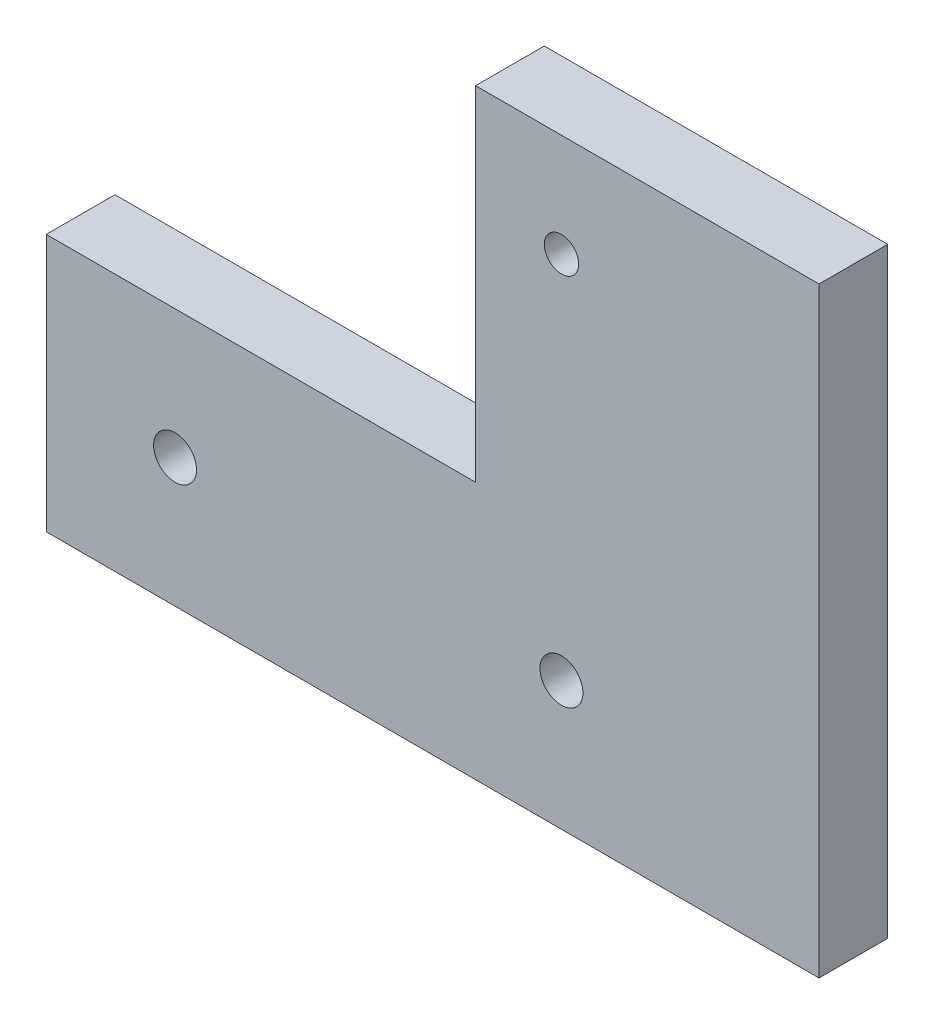
ISO-10303-21;
HEADER;
FILE_DESCRIPTION(('STEP AP214'),'2;1');
FILE_NAME('part.step','',(''),(''),'','','');
FILE_SCHEMA(('AUTOMOTIVE_DESIGN { 1 0 10303 214 1 1 1 1 }'));
ENDSEC;
DATA;
#1=APPLICATION_CONTEXT('core data for automotive mechanical design processes');
#2=APPLICATION_PROTOCOL_DEFINITION('international standard','automotive_design',2000,#1);
#3=PRODUCT_CONTEXT('',#1,'mechanical');
#4=PRODUCT('Part','Part','',(#3));
#5=PRODUCT_RELATED_PRODUCT_CATEGORY('part','',(#4));
#6=PRODUCT_DEFINITION_FORMATION('','',#4);
#7=PRODUCT_DEFINITION_CONTEXT('part definition',#1,'design');
#8=PRODUCT_DEFINITION('design','',#6,#7);
#9=PRODUCT_DEFINITION_SHAPE('','',#8);
#10=(LENGTH_UNIT() NAMED_UNIT(*) SI_UNIT(.MILLI.,.METRE.));
#11=(NAMED_UNIT(*) PLANE_ANGLE_UNIT() SI_UNIT($,.RADIAN.));
#12=(NAMED_UNIT(*) SI_UNIT($,.STERADIAN.) SOLID_ANGLE_UNIT());
#13=UNCERTAINTY_MEASURE_WITH_UNIT(LENGTH_MEASURE(1.E-05),#10,'distance_accuracy_value','');
#14=(GEOMETRIC_REPRESENTATION_CONTEXT(3) GLOBAL_UNCERTAINTY_ASSIGNED_CONTEXT((#13)) GLOBAL_UNIT_ASSIGNED_CONTEXT((#10,
#11,#12)) REPRESENTATION_CONTEXT('',''));
#15=CARTESIAN_POINT('',(0.,0.,0.));
#16=DIRECTION('',(0.,0.,1.));
#17=DIRECTION('',(1.,0.,0.));
#18=AXIS2_PLACEMENT_3D('',#15,#16,#17);
#19=CARTESIAN_POINT('',(0.,0.,8.));
#20=DIRECTION('',(0.,0.,-1.));
#21=DIRECTION('',(-1.,0.,0.));
#22=AXIS2_PLACEMENT_3D('',#19,#20,#21);
#23=PLANE('',#22);
#24=CARTESIAN_POINT('',(-40.7249394487575,5.2940615351541,8.));
#25=DIRECTION('',(0.,0.,-1.));
#26=DIRECTION('',(-1.,0.,0.));
#27=AXIS2_PLACEMENT_3D('',#24,#25,#26);
#28=CIRCLE('',#27,2.);
#29=CARTESIAN_POINT('',(-42.7249394487575,5.2940615351541,8.));
#30=VERTEX_POINT('',#29);
#31=EDGE_CURVE('E186',#30,#30,#28,.T.);
#32=ORIENTED_EDGE('',*,*,#31,.T.);
#33=EDGE_LOOP('',(#32));
#34=FACE_BOUND('',#33,.T.);
#35=CARTESIAN_POINT('',(-85.7249394487575,-37.7059384648459,8.));
#36=DIRECTION('',(0.,0.,1.));
#37=DIRECTION('',(1.,0.,0.));
#38=AXIS2_PLACEMENT_3D('',#35,#36,#37);
#39=CIRCLE('',#38,2.5);
#40=CARTESIAN_POINT('',(-83.2249394487575,-37.7059384648459,8.));
#41=VERTEX_POINT('',#40);
#42=EDGE_CURVE('E124',#41,#41,#39,.T.);
#43=ORIENTED_EDGE('',*,*,#42,.F.);
#44=EDGE_LOOP('',(#43));
#45=FACE_BOUND('',#44,.T.);
#46=DIRECTION('',(0.,-1.,0.));
#47=VECTOR('',#46,1.);
#48=CARTESIAN_POINT('',(-50.7249394487575,-22.7059384648459,8.));
#49=LINE('',#48,#47);
#50=CARTESIAN_POINT('',(-50.7249394487575,17.2940615351541,8.));
#51=VERTEX_POINT('',#50);
#52=CARTESIAN_POINT('',(-50.7249394487575,-22.7059384648459,8.));
#53=VERTEX_POINT('',#52);
#54=EDGE_CURVE('E131',#51,#53,#49,.T.);
#55=ORIENTED_EDGE('',*,*,#54,.T.);
#56=DIRECTION('',(-1.,0.,0.));
#57=VECTOR('',#56,1.);
#58=CARTESIAN_POINT('',(-100.724939448757,-22.7059384648459,8.));
#59=LINE('',#58,#57);
#60=CARTESIAN_POINT('',(-100.724939448757,-22.7059384648459,8.));
#61=VERTEX_POINT('',#60);
#62=EDGE_CURVE('E89',#53,#61,#59,.T.);
#63=ORIENTED_EDGE('',*,*,#62,.T.);
#64=DIRECTION('',(0.,-1.,0.));
#65=VECTOR('',#64,1.);
#66=CARTESIAN_POINT('',(-100.724939448757,-52.7059384648459,8.));
#67=LINE('',#66,#65);
#68=CARTESIAN_POINT('',(-100.724939448757,-52.7059384648459,8.));
#69=VERTEX_POINT('',#68);
#70=EDGE_CURVE('E102',#61,#69,#67,.T.);
#71=ORIENTED_EDGE('',*,*,#70,.T.);
#72=DIRECTION('',(1.,0.,0.));
#73=VECTOR('',#72,1.);
#74=CARTESIAN_POINT('',(-10.7249394487575,-52.7059384648459,8.));
#75=LINE('',#74,#73);
#76=CARTESIAN_POINT('',(-10.7249394487575,-52.7059384648459,8.));
#77=VERTEX_POINT('',#76);
#78=EDGE_CURVE('E96',#69,#77,#75,.T.);
#79=ORIENTED_EDGE('',*,*,#78,.T.);
#80=DIRECTION('',(0.,1.,0.));
#81=VECTOR('',#80,1.);
#82=CARTESIAN_POINT('',(-10.7249394487575,17.2940615351541,8.));
#83=LINE('',#82,#81);
#84=CARTESIAN_POINT('',(-10.7249394487575,17.2940615351541,8.));
#85=VERTEX_POINT('',#84);
#86=EDGE_CURVE('E100',#77,#85,#83,.T.);
#87=ORIENTED_EDGE('',*,*,#86,.T.);
#88=DIRECTION('',(-1.,0.,0.));
#89=VECTOR('',#88,1.);
#90=CARTESIAN_POINT('',(-50.7249394487575,17.2940615351541,8.));
#91=LINE('',#90,#89);
#92=EDGE_CURVE('E52',#85,#51,#91,.T.);
#93=ORIENTED_EDGE('',*,*,#92,.T.);
#94=EDGE_LOOP('',(#55,#63,#71,#79,#87,#93));
#95=FACE_BOUND('',#94,.T.);
#96=CARTESIAN_POINT('',(-40.7249394487575,-37.7059384648459,8.));
#97=DIRECTION('',(0.,0.,1.));
#98=DIRECTION('',(1.,0.,0.));
#99=AXIS2_PLACEMENT_3D('',#96,#97,#98);
#100=CIRCLE('',#99,2.5);
#101=CARTESIAN_POINT('',(-38.2249394487575,-37.7059384648459,8.));
#102=VERTEX_POINT('',#101);
#103=EDGE_CURVE('E200',#102,#102,#100,.T.);
#104=ORIENTED_EDGE('',*,*,#103,.F.);
#105=EDGE_LOOP('',(#104));
#106=FACE_BOUND('',#105,.T.);
#107=ADVANCED_FACE('F35',(#34,#45,#95,#106),#23,.F.);
#108=CARTESIAN_POINT('',(0.,0.,0.));
#109=DIRECTION('',(0.,0.,-1.));
#110=DIRECTION('',(-1.,0.,0.));
#111=AXIS2_PLACEMENT_3D('',#108,#109,#110);
#112=PLANE('',#111);
#113=CARTESIAN_POINT('',(-40.7249394487575,5.2940615351541,0.));
#114=DIRECTION('',(0.,0.,-1.));
#115=DIRECTION('',(-1.,0.,0.));
#116=AXIS2_PLACEMENT_3D('',#113,#114,#115);
#117=CIRCLE('',#116,7.5);
#118=CARTESIAN_POINT('',(-48.2249394487575,5.2940615351541,0.));
#119=VERTEX_POINT('',#118);
#120=EDGE_CURVE('E191',#119,#119,#117,.T.);
#121=ORIENTED_EDGE('',*,*,#120,.F.);
#122=EDGE_LOOP('',(#121));
#123=FACE_BOUND('',#122,.T.);
#124=CARTESIAN_POINT('',(-85.7249394487575,-37.7059384648459,0.));
#125=DIRECTION('',(0.,0.,1.));
#126=DIRECTION('',(1.,0.,0.));
#127=AXIS2_PLACEMENT_3D('',#124,#125,#126);
#128=CIRCLE('',#127,2.5);
#129=CARTESIAN_POINT('',(-83.2249394487575,-37.7059384648459,0.));
#130=VERTEX_POINT('',#129);
#131=EDGE_CURVE('E203',#130,#130,#128,.T.);
#132=ORIENTED_EDGE('',*,*,#131,.T.);
#133=EDGE_LOOP('',(#132));
#134=FACE_BOUND('',#133,.T.);
#135=DIRECTION('',(0.,-1.,0.));
#136=VECTOR('',#135,1.);
#137=CARTESIAN_POINT('',(-50.7249394487575,-22.7059384648459,0.));
#138=LINE('',#137,#136);
#139=CARTESIAN_POINT('',(-50.7249394487575,17.2940615351541,0.));
#140=VERTEX_POINT('',#139);
#141=CARTESIAN_POINT('',(-50.7249394487575,-22.7059384648459,0.));
#142=VERTEX_POINT('',#141);
#143=EDGE_CURVE('E120',#140,#142,#138,.T.);
#144=ORIENTED_EDGE('',*,*,#143,.F.);
#145=DIRECTION('',(-1.,0.,0.));
#146=VECTOR('',#145,1.);
#147=CARTESIAN_POINT('',(-50.7249394487575,17.2940615351541,0.));
#148=LINE('',#147,#146);
#149=CARTESIAN_POINT('',(-10.7249394487575,17.2940615351541,0.));
#150=VERTEX_POINT('',#149);
#151=EDGE_CURVE('E81',#150,#140,#148,.T.);
#152=ORIENTED_EDGE('',*,*,#151,.F.);
#153=DIRECTION('',(0.,1.,0.));
#154=VECTOR('',#153,1.);
#155=CARTESIAN_POINT('',(-10.7249394487575,17.2940615351541,0.));
#156=LINE('',#155,#154);
#157=CARTESIAN_POINT('',(-10.7249394487575,-52.7059384648459,0.));
#158=VERTEX_POINT('',#157);
#159=EDGE_CURVE('E75',#158,#150,#156,.T.);
#160=ORIENTED_EDGE('',*,*,#159,.F.);
#161=DIRECTION('',(1.,0.,0.));
#162=VECTOR('',#161,1.);
#163=CARTESIAN_POINT('',(-10.7249394487575,-52.7059384648459,0.));
#164=LINE('',#163,#162);
#165=CARTESIAN_POINT('',(-100.724939448757,-52.7059384648459,0.));
#166=VERTEX_POINT('',#165);
#167=EDGE_CURVE('E110',#166,#158,#164,.T.);
#168=ORIENTED_EDGE('',*,*,#167,.F.);
#169=DIRECTION('',(0.,-1.,0.));
#170=VECTOR('',#169,1.);
#171=CARTESIAN_POINT('',(-100.724939448757,-52.7059384648459,0.));
#172=LINE('',#171,#170);
#173=CARTESIAN_POINT('',(-100.724939448757,-22.7059384648459,0.));
#174=VERTEX_POINT('',#173);
#175=EDGE_CURVE('E126',#174,#166,#172,.T.);
#176=ORIENTED_EDGE('',*,*,#175,.F.);
#177=DIRECTION('',(-1.,0.,0.));
#178=VECTOR('',#177,1.);
#179=CARTESIAN_POINT('',(-100.724939448757,-22.7059384648459,0.));
#180=LINE('',#179,#178);
#181=EDGE_CURVE('E123',#142,#174,#180,.T.);
#182=ORIENTED_EDGE('',*,*,#181,.F.);
#183=EDGE_LOOP('',(#144,#152,#160,#168,#176,#182));
#184=FACE_BOUND('',#183,.T.);
#185=CARTESIAN_POINT('',(-40.7249394487575,-37.7059384648459,0.));
#186=DIRECTION('',(0.,0.,1.));
#187=DIRECTION('',(1.,0.,0.));
#188=AXIS2_PLACEMENT_3D('',#185,#186,#187);
#189=CIRCLE('',#188,2.5);
#190=CARTESIAN_POINT('',(-38.2249394487575,-37.7059384648459,0.));
#191=VERTEX_POINT('',#190);
#192=EDGE_CURVE('E197',#191,#191,#189,.T.);
#193=ORIENTED_EDGE('',*,*,#192,.T.);
#194=EDGE_LOOP('',(#193));
#195=FACE_BOUND('',#194,.T.);
#196=ADVANCED_FACE('F140',(#123,#134,#184,#195),#112,.T.);
#197=CARTESIAN_POINT('',(-50.7249394487575,-22.7059384648459,8.));
#198=DIRECTION('',(1.,0.,0.));
#199=DIRECTION('',(0.,0.,-1.));
#200=AXIS2_PLACEMENT_3D('',#197,#198,#199);
#201=PLANE('',#200);
#202=ORIENTED_EDGE('',*,*,#143,.T.);
#203=DIRECTION('',(0.,0.,-1.));
#204=VECTOR('',#203,1.);
#205=CARTESIAN_POINT('',(-50.7249394487575,-22.7059384648459,8.));
#206=LINE('',#205,#204);
#207=EDGE_CURVE('E11',#53,#142,#206,.T.);
#208=ORIENTED_EDGE('',*,*,#207,.F.);
#209=ORIENTED_EDGE('',*,*,#54,.F.);
#210=DIRECTION('',(0.,0.,-1.));
#211=VECTOR('',#210,1.);
#212=CARTESIAN_POINT('',(-50.7249394487575,17.2940615351541,8.));
#213=LINE('',#212,#211);
#214=EDGE_CURVE('E116',#51,#140,#213,.T.);
#215=ORIENTED_EDGE('',*,*,#214,.T.);
#216=EDGE_LOOP('',(#202,#208,#209,#215));
#217=FACE_BOUND('',#216,.T.);
#218=ADVANCED_FACE('F37',(#217),#201,.F.);
#219=CARTESIAN_POINT('',(-100.724939448757,-22.7059384648459,8.));
#220=DIRECTION('',(0.,-1.,0.));
#221=DIRECTION('',(0.,0.,-1.));
#222=AXIS2_PLACEMENT_3D('',#219,#220,#221);
#223=PLANE('',#222);
#224=ORIENTED_EDGE('',*,*,#181,.T.);
#225=DIRECTION('',(0.,0.,-1.));
#226=VECTOR('',#225,1.);
#227=CARTESIAN_POINT('',(-100.724939448757,-22.7059384648459,8.));
#228=LINE('',#227,#226);
#229=EDGE_CURVE('E44',#61,#174,#228,.T.);
#230=ORIENTED_EDGE('',*,*,#229,.F.);
#231=ORIENTED_EDGE('',*,*,#62,.F.);
#232=ORIENTED_EDGE('',*,*,#207,.T.);
#233=EDGE_LOOP('',(#224,#230,#231,#232));
#234=FACE_BOUND('',#233,.T.);
#235=ADVANCED_FACE('F266',(#234),#223,.F.);
#236=CARTESIAN_POINT('',(-100.724939448757,-52.7059384648459,8.));
#237=DIRECTION('',(1.,0.,0.));
#238=DIRECTION('',(0.,0.,-1.));
#239=AXIS2_PLACEMENT_3D('',#236,#237,#238);
#240=PLANE('',#239);
#241=ORIENTED_EDGE('',*,*,#175,.T.);
#242=DIRECTION('',(0.,0.,-1.));
#243=VECTOR('',#242,1.);
#244=CARTESIAN_POINT('',(-100.724939448757,-52.7059384648459,8.));
#245=LINE('',#244,#243);
#246=EDGE_CURVE('E111',#69,#166,#245,.T.);
#247=ORIENTED_EDGE('',*,*,#246,.F.);
#248=ORIENTED_EDGE('',*,*,#70,.F.);
#249=ORIENTED_EDGE('',*,*,#229,.T.);
#250=EDGE_LOOP('',(#241,#247,#248,#249));
#251=FACE_BOUND('',#250,.T.);
#252=ADVANCED_FACE('F137',(#251),#240,.F.);
#253=CARTESIAN_POINT('',(-10.7249394487575,-52.7059384648459,8.));
#254=DIRECTION('',(0.,1.,0.));
#255=DIRECTION('',(-1.,0.,0.));
#256=AXIS2_PLACEMENT_3D('',#253,#254,#255);
#257=PLANE('',#256);
#258=ORIENTED_EDGE('',*,*,#167,.T.);
#259=DIRECTION('',(0.,0.,-1.));
#260=VECTOR('',#259,1.);
#261=CARTESIAN_POINT('',(-10.7249394487575,-52.7059384648459,8.));
#262=LINE('',#261,#260);
#263=EDGE_CURVE('E107',#77,#158,#262,.T.);
#264=ORIENTED_EDGE('',*,*,#263,.F.);
#265=ORIENTED_EDGE('',*,*,#78,.F.);
#266=ORIENTED_EDGE('',*,*,#246,.T.);
#267=EDGE_LOOP('',(#258,#264,#265,#266));
#268=FACE_BOUND('',#267,.T.);
#269=ADVANCED_FACE('F108',(#268),#257,.F.);
#270=CARTESIAN_POINT('',(-10.7249394487575,17.2940615351541,8.));
#271=DIRECTION('',(-1.,0.,0.));
#272=DIRECTION('',(0.,-1.,0.));
#273=AXIS2_PLACEMENT_3D('',#270,#271,#272);
#274=PLANE('',#273);
#275=ORIENTED_EDGE('',*,*,#159,.T.);
#276=DIRECTION('',(0.,0.,-1.));
#277=VECTOR('',#276,1.);
#278=CARTESIAN_POINT('',(-10.7249394487575,17.2940615351541,8.));
#279=LINE('',#278,#277);
#280=EDGE_CURVE('E112',#85,#150,#279,.T.);
#281=ORIENTED_EDGE('',*,*,#280,.F.);
#282=ORIENTED_EDGE('',*,*,#86,.F.);
#283=ORIENTED_EDGE('',*,*,#263,.T.);
#284=EDGE_LOOP('',(#275,#281,#282,#283));
#285=FACE_BOUND('',#284,.T.);
#286=ADVANCED_FACE('F114',(#285),#274,.F.);
#287=CARTESIAN_POINT('',(-50.7249394487575,17.2940615351541,8.));
#288=DIRECTION('',(0.,-1.,0.));
#289=DIRECTION('',(1.,0.,0.));
#290=AXIS2_PLACEMENT_3D('',#287,#288,#289);
#291=PLANE('',#290);
#292=ORIENTED_EDGE('',*,*,#151,.T.);
#293=ORIENTED_EDGE('',*,*,#214,.F.);
#294=ORIENTED_EDGE('',*,*,#92,.F.);
#295=ORIENTED_EDGE('',*,*,#280,.T.);
#296=EDGE_LOOP('',(#292,#293,#294,#295));
#297=FACE_BOUND('',#296,.T.);
#298=ADVANCED_FACE('F145',(#297),#291,.F.);
#299=CARTESIAN_POINT('',(-85.7249394487575,-37.7059384648459,8.));
#300=DIRECTION('',(0.,0.,-1.));
#301=DIRECTION('',(-1.,0.,0.));
#302=AXIS2_PLACEMENT_3D('',#299,#300,#301);
#303=CYLINDRICAL_SURFACE('',#302,2.5);
#304=ORIENTED_EDGE('',*,*,#42,.T.);
#305=EDGE_LOOP('',(#304));
#306=FACE_BOUND('',#305,.T.);
#307=ORIENTED_EDGE('',*,*,#131,.F.);
#308=EDGE_LOOP('',(#307));
#309=FACE_BOUND('',#308,.T.);
#310=ADVANCED_FACE('F147',(#306,#309),#303,.F.);
#311=CARTESIAN_POINT('',(-40.7249394487575,-37.7059384648459,8.));
#312=DIRECTION('',(0.,0.,-1.));
#313=DIRECTION('',(-1.,0.,0.));
#314=AXIS2_PLACEMENT_3D('',#311,#312,#313);
#315=CYLINDRICAL_SURFACE('',#314,2.5);
#316=ORIENTED_EDGE('',*,*,#103,.T.);
#317=EDGE_LOOP('',(#316));
#318=FACE_BOUND('',#317,.T.);
#319=ORIENTED_EDGE('',*,*,#192,.F.);
#320=EDGE_LOOP('',(#319));
#321=FACE_BOUND('',#320,.T.);
#322=ADVANCED_FACE('F153',(#318,#321),#315,.F.);
#323=CARTESIAN_POINT('',(-40.7249394487575,5.2940615351541,5.));
#324=DIRECTION('',(0.,0.,-1.));
#325=DIRECTION('',(-1.,0.,0.));
#326=AXIS2_PLACEMENT_3D('',#323,#324,#325);
#327=CYLINDRICAL_SURFACE('',#326,7.5);
#328=CARTESIAN_POINT('',(-40.7249394487575,5.2940615351541,5.));
#329=DIRECTION('',(0.,0.,-1.));
#330=DIRECTION('',(-1.,0.,0.));
#331=AXIS2_PLACEMENT_3D('',#328,#329,#330);
#332=CIRCLE('',#331,7.5);
#333=CARTESIAN_POINT('',(-48.2249394487575,5.2940615351541,5.));
#334=VERTEX_POINT('',#333);
#335=EDGE_CURVE('E194',#334,#334,#332,.T.);
#336=ORIENTED_EDGE('',*,*,#335,.F.);
#337=EDGE_LOOP('',(#336));
#338=FACE_BOUND('',#337,.T.);
#339=ORIENTED_EDGE('',*,*,#120,.T.);
#340=EDGE_LOOP('',(#339));
#341=FACE_BOUND('',#340,.T.);
#342=ADVANCED_FACE('F170',(#338,#341),#327,.F.);
#343=CARTESIAN_POINT('',(-40.7249394487575,5.2940615351541,5.));
#344=DIRECTION('',(0.,0.,-1.));
#345=DIRECTION('',(-1.,0.,0.));
#346=AXIS2_PLACEMENT_3D('',#343,#344,#345);
#347=PLANE('',#346);
#348=CARTESIAN_POINT('',(-40.7249394487575,5.2940615351541,5.));
#349=DIRECTION('',(0.,0.,-1.));
#350=DIRECTION('',(-1.,0.,0.));
#351=AXIS2_PLACEMENT_3D('',#348,#349,#350);
#352=CIRCLE('',#351,2.);
#353=CARTESIAN_POINT('',(-42.7249394487575,5.2940615351541,5.));
#354=VERTEX_POINT('',#353);
#355=EDGE_CURVE('E189',#354,#354,#352,.T.);
#356=ORIENTED_EDGE('',*,*,#355,.F.);
#357=EDGE_LOOP('',(#356));
#358=FACE_BOUND('',#357,.T.);
#359=ORIENTED_EDGE('',*,*,#335,.T.);
#360=EDGE_LOOP('',(#359));
#361=FACE_BOUND('',#360,.T.);
#362=ADVANCED_FACE('F174',(#358,#361),#347,.T.);
#363=CARTESIAN_POINT('',(-40.7249394487575,5.2940615351541,8.));
#364=DIRECTION('',(0.,0.,-1.));
#365=DIRECTION('',(-1.,0.,0.));
#366=AXIS2_PLACEMENT_3D('',#363,#364,#365);
#367=CYLINDRICAL_SURFACE('',#366,2.);
#368=ORIENTED_EDGE('',*,*,#31,.F.);
#369=EDGE_LOOP('',(#368));
#370=FACE_BOUND('',#369,.T.);
#371=ORIENTED_EDGE('',*,*,#355,.T.);
#372=EDGE_LOOP('',(#371));
#373=FACE_BOUND('',#372,.T.);
#374=ADVANCED_FACE('F178',(#370,#373),#367,.F.);
#375=CLOSED_SHELL('',(#107,#196,#218,#235,#252,#269,#286,#298,#310,#322,#342,#362,#374));
#376=MANIFOLD_SOLID_BREP('B2',#375);
#377=ADVANCED_BREP_SHAPE_REPRESENTATION('',(#18,#376),#14);
#378=SHAPE_DEFINITION_REPRESENTATION(#9,#377);
ENDSEC;
END-ISO-10303-21;
